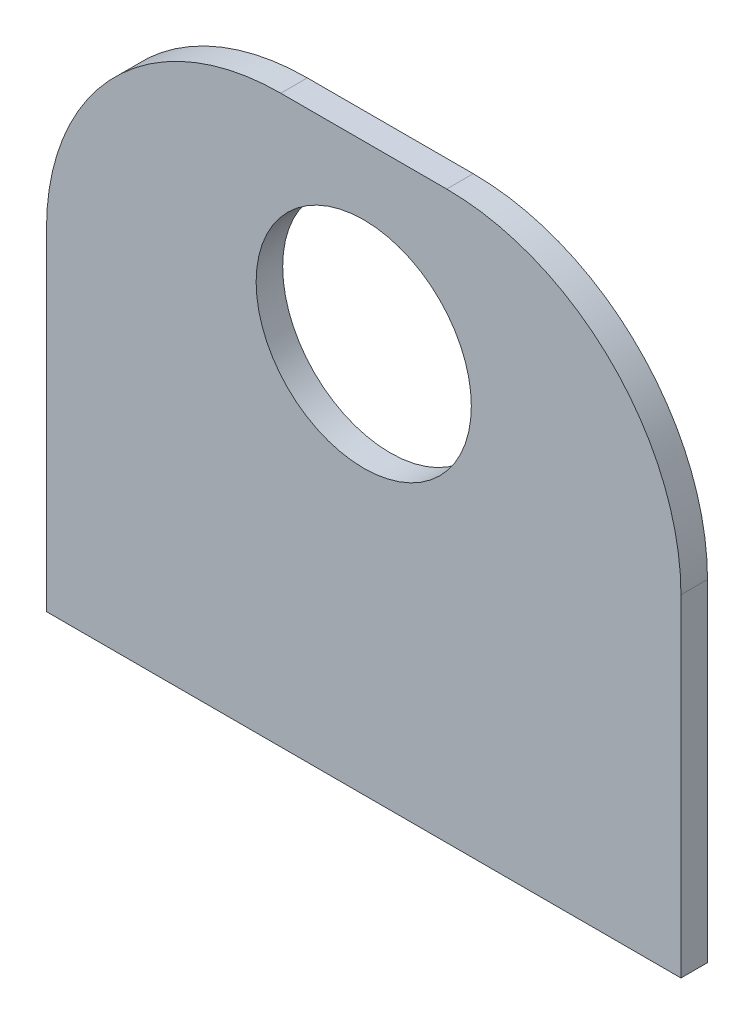
ISO-10303-21;
HEADER;
FILE_DESCRIPTION(('STEP AP214'),'2;1');
FILE_NAME('part.step','',(''),(''),'','','');
FILE_SCHEMA(('AUTOMOTIVE_DESIGN { 1 0 10303 214 1 1 1 1 }'));
ENDSEC;
DATA;
#1=APPLICATION_CONTEXT('core data for automotive mechanical design processes');
#2=APPLICATION_PROTOCOL_DEFINITION('international standard','automotive_design',2000,#1);
#3=PRODUCT_CONTEXT('',#1,'mechanical');
#4=PRODUCT('Part','Part','',(#3));
#5=PRODUCT_RELATED_PRODUCT_CATEGORY('part','',(#4));
#6=PRODUCT_DEFINITION_FORMATION('','',#4);
#7=PRODUCT_DEFINITION_CONTEXT('part definition',#1,'design');
#8=PRODUCT_DEFINITION('design','',#6,#7);
#9=PRODUCT_DEFINITION_SHAPE('','',#8);
#10=(LENGTH_UNIT() NAMED_UNIT(*) SI_UNIT(.MILLI.,.METRE.));
#11=(NAMED_UNIT(*) PLANE_ANGLE_UNIT() SI_UNIT($,.RADIAN.));
#12=(NAMED_UNIT(*) SI_UNIT($,.STERADIAN.) SOLID_ANGLE_UNIT());
#13=UNCERTAINTY_MEASURE_WITH_UNIT(LENGTH_MEASURE(1.E-05),#10,'distance_accuracy_value','');
#14=(GEOMETRIC_REPRESENTATION_CONTEXT(3) GLOBAL_UNCERTAINTY_ASSIGNED_CONTEXT((#13)) GLOBAL_UNIT_ASSIGNED_CONTEXT((#10,
#11,#12)) REPRESENTATION_CONTEXT('',''));
#15=CARTESIAN_POINT('',(0.,0.,0.));
#16=DIRECTION('',(0.,0.,1.));
#17=DIRECTION('',(1.,0.,0.));
#18=AXIS2_PLACEMENT_3D('',#15,#16,#17);
#19=CARTESIAN_POINT('',(0.,36.83,1.7272));
#20=DIRECTION('',(0.,1.,0.));
#21=DIRECTION('',(-1.,0.,0.));
#22=AXIS2_PLACEMENT_3D('',#19,#20,#21);
#23=PLANE('',#22);
#24=DIRECTION('',(1.,0.,0.));
#25=VECTOR('',#24,1.);
#26=CARTESIAN_POINT('',(0.,36.83,0.));
#27=LINE('',#26,#25);
#28=CARTESIAN_POINT('',(-5.39750000000001,36.83,0.));
#29=VERTEX_POINT('',#28);
#30=CARTESIAN_POINT('',(5.3975,36.83,0.));
#31=VERTEX_POINT('',#30);
#32=EDGE_CURVE('E123',#29,#31,#27,.T.);
#33=ORIENTED_EDGE('',*,*,#32,.F.);
#34=DIRECTION('',(0.,0.,-1.));
#35=VECTOR('',#34,1.);
#36=CARTESIAN_POINT('',(-5.39750000000001,36.83,1.7272));
#37=LINE('',#36,#35);
#38=CARTESIAN_POINT('',(-5.39750000000001,36.83,1.7272));
#39=VERTEX_POINT('',#38);
#40=EDGE_CURVE('E140',#29,#39,#37,.F.);
#41=ORIENTED_EDGE('',*,*,#40,.T.);
#42=DIRECTION('',(1.,0.,0.));
#43=VECTOR('',#42,1.);
#44=CARTESIAN_POINT('',(0.,36.83,1.7272));
#45=LINE('',#44,#43);
#46=CARTESIAN_POINT('',(5.3975,36.83,1.7272));
#47=VERTEX_POINT('',#46);
#48=EDGE_CURVE('E113',#39,#47,#45,.T.);
#49=ORIENTED_EDGE('',*,*,#48,.T.);
#50=DIRECTION('',(0.,0.,-1.));
#51=VECTOR('',#50,1.);
#52=CARTESIAN_POINT('',(5.3975,36.83,0.));
#53=LINE('',#52,#51);
#54=EDGE_CURVE('E137',#47,#31,#53,.T.);
#55=ORIENTED_EDGE('',*,*,#54,.T.);
#56=EDGE_LOOP('',(#33,#41,#49,#55));
#57=FACE_BOUND('',#56,.T.);
#58=ADVANCED_FACE('F36',(#57),#23,.T.);
#59=CARTESIAN_POINT('',(-20.6375,-24.7536811763211,1.7272));
#60=DIRECTION('',(-1.,0.,0.));
#61=DIRECTION('',(0.,0.,1.));
#62=AXIS2_PLACEMENT_3D('',#59,#60,#61);
#63=PLANE('',#62);
#64=DIRECTION('',(0.,1.,0.));
#65=VECTOR('',#64,1.);
#66=CARTESIAN_POINT('',(-20.6375,-24.7536811763211,1.7272));
#67=LINE('',#66,#65);
#68=CARTESIAN_POINT('',(-20.6375,0.,1.7272));
#69=VERTEX_POINT('',#68);
#70=CARTESIAN_POINT('',(-20.6375,21.59,1.7272));
#71=VERTEX_POINT('',#70);
#72=EDGE_CURVE('E94',#69,#71,#67,.T.);
#73=ORIENTED_EDGE('',*,*,#72,.T.);
#74=DIRECTION('',(0.,0.,-1.));
#75=VECTOR('',#74,1.);
#76=CARTESIAN_POINT('',(-20.6375,21.59,1.7272));
#77=LINE('',#76,#75);
#78=CARTESIAN_POINT('',(-20.6375,21.59,0.));
#79=VERTEX_POINT('',#78);
#80=EDGE_CURVE('E101',#71,#79,#77,.T.);
#81=ORIENTED_EDGE('',*,*,#80,.T.);
#82=DIRECTION('',(0.,1.,0.));
#83=VECTOR('',#82,1.);
#84=CARTESIAN_POINT('',(-20.6375,-24.7536811763211,0.));
#85=LINE('',#84,#83);
#86=CARTESIAN_POINT('',(-20.6375,0.,0.));
#87=VERTEX_POINT('',#86);
#88=EDGE_CURVE('E97',#87,#79,#85,.T.);
#89=ORIENTED_EDGE('',*,*,#88,.F.);
#90=DIRECTION('',(0.,0.,-1.));
#91=VECTOR('',#90,1.);
#92=CARTESIAN_POINT('',(-20.6375,0.,1.7272));
#93=LINE('',#92,#91);
#94=EDGE_CURVE('E89',#69,#87,#93,.T.);
#95=ORIENTED_EDGE('',*,*,#94,.F.);
#96=EDGE_LOOP('',(#73,#81,#89,#95));
#97=FACE_BOUND('',#96,.T.);
#98=ADVANCED_FACE('F91',(#97),#63,.T.);
#99=CARTESIAN_POINT('',(0.,0.,1.7272));
#100=DIRECTION('',(0.,1.,0.));
#101=DIRECTION('',(-1.,0.,0.));
#102=AXIS2_PLACEMENT_3D('',#99,#100,#101);
#103=PLANE('',#102);
#104=DIRECTION('',(1.,0.,0.));
#105=VECTOR('',#104,1.);
#106=CARTESIAN_POINT('',(0.,0.,0.));
#107=LINE('',#106,#105);
#108=CARTESIAN_POINT('',(20.6375,0.,0.));
#109=VERTEX_POINT('',#108);
#110=EDGE_CURVE('E127',#87,#109,#107,.T.);
#111=ORIENTED_EDGE('',*,*,#110,.T.);
#112=DIRECTION('',(0.,0.,-1.));
#113=VECTOR('',#112,1.);
#114=CARTESIAN_POINT('',(20.6375,0.,1.7272));
#115=LINE('',#114,#113);
#116=CARTESIAN_POINT('',(20.6375,0.,1.7272));
#117=VERTEX_POINT('',#116);
#118=EDGE_CURVE('E102',#117,#109,#115,.T.);
#119=ORIENTED_EDGE('',*,*,#118,.F.);
#120=DIRECTION('',(1.,0.,0.));
#121=VECTOR('',#120,1.);
#122=CARTESIAN_POINT('',(0.,0.,1.7272));
#123=LINE('',#122,#121);
#124=EDGE_CURVE('E106',#69,#117,#123,.T.);
#125=ORIENTED_EDGE('',*,*,#124,.F.);
#126=ORIENTED_EDGE('',*,*,#94,.T.);
#127=EDGE_LOOP('',(#111,#119,#125,#126));
#128=FACE_BOUND('',#127,.T.);
#129=ADVANCED_FACE('F107',(#128),#103,.F.);
#130=CARTESIAN_POINT('',(0.,25.4,1.7272));
#131=DIRECTION('',(0.,0.,-1.));
#132=DIRECTION('',(-1.,0.,0.));
#133=AXIS2_PLACEMENT_3D('',#130,#131,#132);
#134=CYLINDRICAL_SURFACE('',#133,7.);
#135=CARTESIAN_POINT('',(0.,25.4,1.7272));
#136=DIRECTION('',(0.,0.,1.));
#137=DIRECTION('',(1.,0.,0.));
#138=AXIS2_PLACEMENT_3D('',#135,#136,#137);
#139=CIRCLE('',#138,7.);
#140=CARTESIAN_POINT('',(7.,25.4,1.7272));
#141=VERTEX_POINT('',#140);
#142=EDGE_CURVE('E115',#141,#141,#139,.T.);
#143=ORIENTED_EDGE('',*,*,#142,.T.);
#144=EDGE_LOOP('',(#143));
#145=FACE_BOUND('',#144,.T.);
#146=CARTESIAN_POINT('',(0.,25.4,0.));
#147=DIRECTION('',(0.,0.,1.));
#148=DIRECTION('',(1.,0.,0.));
#149=AXIS2_PLACEMENT_3D('',#146,#147,#148);
#150=CIRCLE('',#149,7.);
#151=CARTESIAN_POINT('',(7.,25.4,0.));
#152=VERTEX_POINT('',#151);
#153=EDGE_CURVE('E120',#152,#152,#150,.T.);
#154=ORIENTED_EDGE('',*,*,#153,.F.);
#155=EDGE_LOOP('',(#154));
#156=FACE_BOUND('',#155,.T.);
#157=ADVANCED_FACE('F164',(#145,#156),#134,.F.);
#158=CARTESIAN_POINT('',(20.6375,-24.7536811763211,1.7272));
#159=DIRECTION('',(-1.,0.,0.));
#160=DIRECTION('',(0.,-1.,0.));
#161=AXIS2_PLACEMENT_3D('',#158,#159,#160);
#162=PLANE('',#161);
#163=DIRECTION('',(0.,1.,0.));
#164=VECTOR('',#163,1.);
#165=CARTESIAN_POINT('',(20.6375,-24.7536811763211,0.));
#166=LINE('',#165,#164);
#167=CARTESIAN_POINT('',(20.6375,21.59,0.));
#168=VERTEX_POINT('',#167);
#169=EDGE_CURVE('E129',#109,#168,#166,.T.);
#170=ORIENTED_EDGE('',*,*,#169,.T.);
#171=DIRECTION('',(0.,0.,-1.));
#172=VECTOR('',#171,1.);
#173=CARTESIAN_POINT('',(20.6375,21.59,1.7272));
#174=LINE('',#173,#172);
#175=CARTESIAN_POINT('',(20.6375,21.59,1.7272));
#176=VERTEX_POINT('',#175);
#177=EDGE_CURVE('E11',#168,#176,#174,.F.);
#178=ORIENTED_EDGE('',*,*,#177,.T.);
#179=DIRECTION('',(0.,1.,0.));
#180=VECTOR('',#179,1.);
#181=CARTESIAN_POINT('',(20.6375,-24.7536811763211,1.7272));
#182=LINE('',#181,#180);
#183=EDGE_CURVE('E109',#117,#176,#182,.T.);
#184=ORIENTED_EDGE('',*,*,#183,.F.);
#185=ORIENTED_EDGE('',*,*,#118,.T.);
#186=EDGE_LOOP('',(#170,#178,#184,#185));
#187=FACE_BOUND('',#186,.T.);
#188=ADVANCED_FACE('F150',(#187),#162,.F.);
#189=CARTESIAN_POINT('',(0.,-24.7536811763211,1.7272));
#190=DIRECTION('',(0.,0.,1.));
#191=DIRECTION('',(1.,0.,0.));
#192=AXIS2_PLACEMENT_3D('',#189,#190,#191);
#193=PLANE('',#192);
#194=ORIENTED_EDGE('',*,*,#142,.F.);
#195=EDGE_LOOP('',(#194));
#196=FACE_BOUND('',#195,.T.);
#197=ORIENTED_EDGE('',*,*,#48,.F.);
#198=CARTESIAN_POINT('',(-5.3975,21.59,1.7272));
#199=DIRECTION('',(0.,0.,1.));
#200=DIRECTION('',(1.,0.,0.));
#201=AXIS2_PLACEMENT_3D('',#198,#199,#200);
#202=CIRCLE('',#201,15.24);
#203=EDGE_CURVE('E44',#39,#71,#202,.T.);
#204=ORIENTED_EDGE('',*,*,#203,.T.);
#205=ORIENTED_EDGE('',*,*,#72,.F.);
#206=ORIENTED_EDGE('',*,*,#124,.T.);
#207=ORIENTED_EDGE('',*,*,#183,.T.);
#208=CARTESIAN_POINT('',(5.39750000000001,21.59,1.7272));
#209=DIRECTION('',(0.,0.,1.));
#210=DIRECTION('',(1.,0.,0.));
#211=AXIS2_PLACEMENT_3D('',#208,#209,#210);
#212=CIRCLE('',#211,15.24);
#213=EDGE_CURVE('E56',#176,#47,#212,.T.);
#214=ORIENTED_EDGE('',*,*,#213,.T.);
#215=EDGE_LOOP('',(#197,#204,#205,#206,#207,#214));
#216=FACE_BOUND('',#215,.T.);
#217=ADVANCED_FACE('F111',(#196,#216),#193,.T.);
#218=CARTESIAN_POINT('',(0.,-24.7536811763211,0.));
#219=DIRECTION('',(0.,0.,1.));
#220=DIRECTION('',(1.,0.,0.));
#221=AXIS2_PLACEMENT_3D('',#218,#219,#220);
#222=PLANE('',#221);
#223=ORIENTED_EDGE('',*,*,#153,.T.);
#224=EDGE_LOOP('',(#223));
#225=FACE_BOUND('',#224,.T.);
#226=ORIENTED_EDGE('',*,*,#88,.T.);
#227=CARTESIAN_POINT('',(-5.3975,21.59,0.));
#228=DIRECTION('',(0.,0.,1.));
#229=DIRECTION('',(1.,0.,0.));
#230=AXIS2_PLACEMENT_3D('',#227,#228,#229);
#231=CIRCLE('',#230,15.24);
#232=EDGE_CURVE('E135',#79,#29,#231,.F.);
#233=ORIENTED_EDGE('',*,*,#232,.T.);
#234=ORIENTED_EDGE('',*,*,#32,.T.);
#235=CARTESIAN_POINT('',(5.39750000000001,21.59,0.));
#236=DIRECTION('',(0.,0.,1.));
#237=DIRECTION('',(1.,0.,0.));
#238=AXIS2_PLACEMENT_3D('',#235,#236,#237);
#239=CIRCLE('',#238,15.24);
#240=EDGE_CURVE('E133',#31,#168,#239,.F.);
#241=ORIENTED_EDGE('',*,*,#240,.T.);
#242=ORIENTED_EDGE('',*,*,#169,.F.);
#243=ORIENTED_EDGE('',*,*,#110,.F.);
#244=EDGE_LOOP('',(#226,#233,#234,#241,#242,#243));
#245=FACE_BOUND('',#244,.T.);
#246=ADVANCED_FACE('F149',(#225,#245),#222,.F.);
#247=CARTESIAN_POINT('',(-5.3975,21.59,1.7272));
#248=DIRECTION('',(0.,0.,-1.));
#249=DIRECTION('',(-1.,0.,0.));
#250=AXIS2_PLACEMENT_3D('',#247,#248,#249);
#251=CYLINDRICAL_SURFACE('',#250,15.24);
#252=ORIENTED_EDGE('',*,*,#203,.F.);
#253=ORIENTED_EDGE('',*,*,#40,.F.);
#254=ORIENTED_EDGE('',*,*,#232,.F.);
#255=ORIENTED_EDGE('',*,*,#80,.F.);
#256=EDGE_LOOP('',(#252,#253,#254,#255));
#257=FACE_BOUND('',#256,.T.);
#258=ADVANCED_FACE('F147',(#257),#251,.T.);
#259=CARTESIAN_POINT('',(5.39750000000001,21.59,1.7272));
#260=DIRECTION('',(0.,0.,1.));
#261=DIRECTION('',(1.,0.,0.));
#262=AXIS2_PLACEMENT_3D('',#259,#260,#261);
#263=CYLINDRICAL_SURFACE('',#262,15.24);
#264=ORIENTED_EDGE('',*,*,#213,.F.);
#265=ORIENTED_EDGE('',*,*,#177,.F.);
#266=ORIENTED_EDGE('',*,*,#240,.F.);
#267=ORIENTED_EDGE('',*,*,#54,.F.);
#268=EDGE_LOOP('',(#264,#265,#266,#267));
#269=FACE_BOUND('',#268,.T.);
#270=ADVANCED_FACE('F38',(#269),#263,.T.);
#271=CLOSED_SHELL('',(#58,#98,#129,#157,#188,#217,#246,#258,#270));
#272=MANIFOLD_SOLID_BREP('B2',#271);
#273=ADVANCED_BREP_SHAPE_REPRESENTATION('',(#18,#272),#14);
#274=SHAPE_DEFINITION_REPRESENTATION(#9,#273);
ENDSEC;
END-ISO-10303-21;
